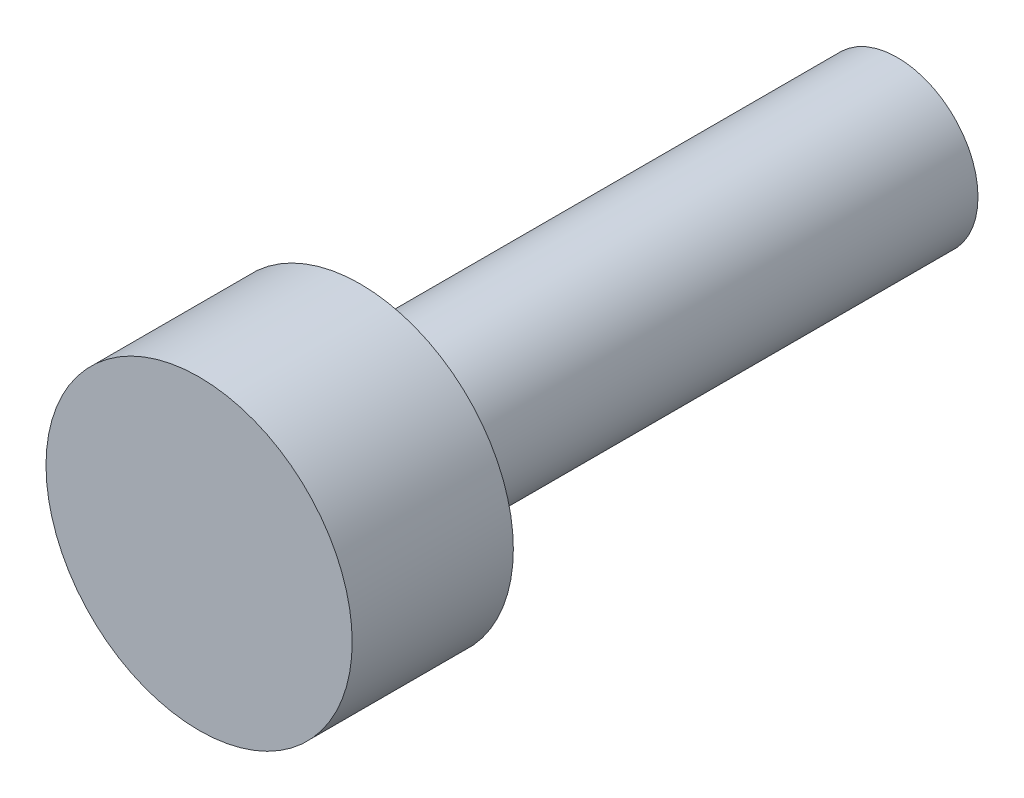
ISO-10303-21;
HEADER;
FILE_DESCRIPTION(('STEP AP214'),'2;1');
FILE_NAME('part.step','',(''),(''),'','','');
FILE_SCHEMA(('AUTOMOTIVE_DESIGN { 1 0 10303 214 1 1 1 1 }'));
ENDSEC;
DATA;
#1=APPLICATION_CONTEXT('core data for automotive mechanical design processes');
#2=APPLICATION_PROTOCOL_DEFINITION('international standard','automotive_design',2000,#1);
#3=PRODUCT_CONTEXT('',#1,'mechanical');
#4=PRODUCT('Part','Part','',(#3));
#5=PRODUCT_RELATED_PRODUCT_CATEGORY('part','',(#4));
#6=PRODUCT_DEFINITION_FORMATION('','',#4);
#7=PRODUCT_DEFINITION_CONTEXT('part definition',#1,'design');
#8=PRODUCT_DEFINITION('design','',#6,#7);
#9=PRODUCT_DEFINITION_SHAPE('','',#8);
#10=(LENGTH_UNIT() NAMED_UNIT(*) SI_UNIT(.MILLI.,.METRE.));
#11=(NAMED_UNIT(*) PLANE_ANGLE_UNIT() SI_UNIT($,.RADIAN.));
#12=(NAMED_UNIT(*) SI_UNIT($,.STERADIAN.) SOLID_ANGLE_UNIT());
#13=UNCERTAINTY_MEASURE_WITH_UNIT(LENGTH_MEASURE(1.E-05),#10,'distance_accuracy_value','');
#14=(GEOMETRIC_REPRESENTATION_CONTEXT(3) GLOBAL_UNCERTAINTY_ASSIGNED_CONTEXT((#13)) GLOBAL_UNIT_ASSIGNED_CONTEXT((#10,
#11,#12)) REPRESENTATION_CONTEXT('',''));
#15=CARTESIAN_POINT('',(0.,0.,0.));
#16=DIRECTION('',(0.,0.,1.));
#17=DIRECTION('',(1.,0.,0.));
#18=AXIS2_PLACEMENT_3D('',#15,#16,#17);
#19=CARTESIAN_POINT('',(0.,0.,10.));
#20=DIRECTION('',(0.,0.,-1.));
#21=DIRECTION('',(-1.,0.,0.));
#22=AXIS2_PLACEMENT_3D('',#19,#20,#21);
#23=CYLINDRICAL_SURFACE('',#22,1.5);
#24=CARTESIAN_POINT('',(0.,0.,10.));
#25=DIRECTION('',(0.,0.,1.));
#26=DIRECTION('',(1.,0.,0.));
#27=AXIS2_PLACEMENT_3D('',#24,#25,#26);
#28=CIRCLE('',#27,1.5);
#29=CARTESIAN_POINT('',(1.5,0.,10.));
#30=VERTEX_POINT('',#29);
#31=EDGE_CURVE('E10',#30,#30,#28,.T.);
#32=ORIENTED_EDGE('',*,*,#31,.F.);
#33=EDGE_LOOP('',(#32));
#34=FACE_BOUND('',#33,.T.);
#35=CARTESIAN_POINT('',(0.,0.,0.));
#36=DIRECTION('',(0.,0.,1.));
#37=DIRECTION('',(1.,0.,0.));
#38=AXIS2_PLACEMENT_3D('',#35,#36,#37);
#39=CIRCLE('',#38,1.5);
#40=CARTESIAN_POINT('',(1.5,0.,0.));
#41=VERTEX_POINT('',#40);
#42=EDGE_CURVE('E36',#41,#41,#39,.T.);
#43=ORIENTED_EDGE('',*,*,#42,.T.);
#44=EDGE_LOOP('',(#43));
#45=FACE_BOUND('',#44,.T.);
#46=ADVANCED_FACE('F33',(#34,#45),#23,.T.);
#47=CARTESIAN_POINT('',(0.,0.,0.));
#48=DIRECTION('',(0.,0.,1.));
#49=DIRECTION('',(1.,0.,0.));
#50=AXIS2_PLACEMENT_3D('',#47,#48,#49);
#51=PLANE('',#50);
#52=ORIENTED_EDGE('',*,*,#42,.F.);
#53=EDGE_LOOP('',(#52));
#54=FACE_BOUND('',#53,.T.);
#55=ADVANCED_FACE('F56',(#54),#51,.F.);
#56=CARTESIAN_POINT('',(0.,0.,13.));
#57=DIRECTION('',(0.,0.,-1.));
#58=DIRECTION('',(-1.,0.,0.));
#59=AXIS2_PLACEMENT_3D('',#56,#57,#58);
#60=CYLINDRICAL_SURFACE('',#59,2.85);
#61=CARTESIAN_POINT('',(0.,0.,13.));
#62=DIRECTION('',(0.,0.,1.));
#63=DIRECTION('',(1.,0.,0.));
#64=AXIS2_PLACEMENT_3D('',#61,#62,#63);
#65=CIRCLE('',#64,2.85);
#66=CARTESIAN_POINT('',(2.85,0.,13.));
#67=VERTEX_POINT('',#66);
#68=EDGE_CURVE('E43',#67,#67,#65,.T.);
#69=ORIENTED_EDGE('',*,*,#68,.F.);
#70=EDGE_LOOP('',(#69));
#71=FACE_BOUND('',#70,.T.);
#72=CARTESIAN_POINT('',(0.,0.,10.));
#73=DIRECTION('',(0.,0.,1.));
#74=DIRECTION('',(1.,0.,0.));
#75=AXIS2_PLACEMENT_3D('',#72,#73,#74);
#76=CIRCLE('',#75,2.85);
#77=CARTESIAN_POINT('',(2.85,0.,10.));
#78=VERTEX_POINT('',#77);
#79=EDGE_CURVE('E45',#78,#78,#76,.T.);
#80=ORIENTED_EDGE('',*,*,#79,.T.);
#81=EDGE_LOOP('',(#80));
#82=FACE_BOUND('',#81,.T.);
#83=ADVANCED_FACE('F53',(#71,#82),#60,.T.);
#84=CARTESIAN_POINT('',(0.,0.,13.));
#85=DIRECTION('',(0.,0.,1.));
#86=DIRECTION('',(1.,0.,0.));
#87=AXIS2_PLACEMENT_3D('',#84,#85,#86);
#88=PLANE('',#87);
#89=ORIENTED_EDGE('',*,*,#68,.T.);
#90=EDGE_LOOP('',(#89));
#91=FACE_BOUND('',#90,.T.);
#92=ADVANCED_FACE('F51',(#91),#88,.T.);
#93=CARTESIAN_POINT('',(0.,0.,10.));
#94=DIRECTION('',(0.,0.,1.));
#95=DIRECTION('',(1.,0.,0.));
#96=AXIS2_PLACEMENT_3D('',#93,#94,#95);
#97=PLANE('',#96);
#98=ORIENTED_EDGE('',*,*,#31,.T.);
#99=EDGE_LOOP('',(#98));
#100=FACE_BOUND('',#99,.T.);
#101=ORIENTED_EDGE('',*,*,#79,.F.);
#102=EDGE_LOOP('',(#101));
#103=FACE_BOUND('',#102,.T.);
#104=ADVANCED_FACE('F60',(#100,#103),#97,.F.);
#105=CLOSED_SHELL('',(#46,#55,#83,#92,#104));
#106=MANIFOLD_SOLID_BREP('B2',#105);
#107=ADVANCED_BREP_SHAPE_REPRESENTATION('',(#18,#106),#14);
#108=SHAPE_DEFINITION_REPRESENTATION(#9,#107);
ENDSEC;
END-ISO-10303-21;
